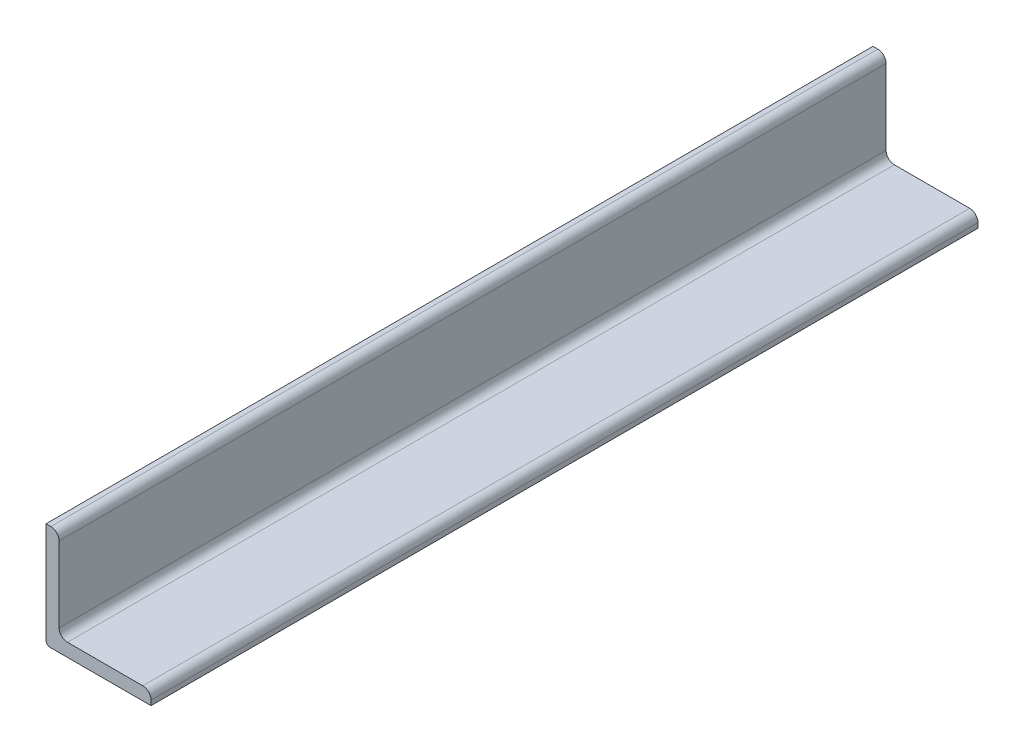
ISO-10303-21;
HEADER;
FILE_DESCRIPTION(('STEP AP214'),'2;1');
FILE_NAME('part.step','',(''),(''),'','','');
FILE_SCHEMA(('AUTOMOTIVE_DESIGN { 1 0 10303 214 1 1 1 1 }'));
ENDSEC;
DATA;
#1=APPLICATION_CONTEXT('core data for automotive mechanical design processes');
#2=APPLICATION_PROTOCOL_DEFINITION('international standard','automotive_design',2000,#1);
#3=PRODUCT_CONTEXT('',#1,'mechanical');
#4=PRODUCT('Part','Part','',(#3));
#5=PRODUCT_RELATED_PRODUCT_CATEGORY('part','',(#4));
#6=PRODUCT_DEFINITION_FORMATION('','',#4);
#7=PRODUCT_DEFINITION_CONTEXT('part definition',#1,'design');
#8=PRODUCT_DEFINITION('design','',#6,#7);
#9=PRODUCT_DEFINITION_SHAPE('','',#8);
#10=(LENGTH_UNIT() NAMED_UNIT(*) SI_UNIT(.MILLI.,.METRE.));
#11=(NAMED_UNIT(*) PLANE_ANGLE_UNIT() SI_UNIT($,.RADIAN.));
#12=(NAMED_UNIT(*) SI_UNIT($,.STERADIAN.) SOLID_ANGLE_UNIT());
#13=UNCERTAINTY_MEASURE_WITH_UNIT(LENGTH_MEASURE(1.E-05),#10,'distance_accuracy_value','');
#14=(GEOMETRIC_REPRESENTATION_CONTEXT(3) GLOBAL_UNCERTAINTY_ASSIGNED_CONTEXT((#13)) GLOBAL_UNIT_ASSIGNED_CONTEXT((#10,
#11,#12)) REPRESENTATION_CONTEXT('',''));
#15=CARTESIAN_POINT('',(0.,0.,0.));
#16=DIRECTION('',(0.,0.,1.));
#17=DIRECTION('',(1.,0.,0.));
#18=AXIS2_PLACEMENT_3D('',#15,#16,#17);
#19=CARTESIAN_POINT('',(12.7,0.,100.));
#20=DIRECTION('',(0.,1.,0.));
#21=DIRECTION('',(-1.,0.,0.));
#22=AXIS2_PLACEMENT_3D('',#19,#20,#21);
#23=PLANE('',#22);
#24=DIRECTION('',(1.,0.,0.));
#25=VECTOR('',#24,1.);
#26=CARTESIAN_POINT('',(12.7,0.,100.));
#27=LINE('',#26,#25);
#28=CARTESIAN_POINT('',(0.5,0.,100.));
#29=VERTEX_POINT('',#28);
#30=CARTESIAN_POINT('',(12.7,0.,100.));
#31=VERTEX_POINT('',#30);
#32=EDGE_CURVE('E109',#29,#31,#27,.T.);
#33=ORIENTED_EDGE('',*,*,#32,.F.);
#34=DIRECTION('',(0.,0.,-1.));
#35=VECTOR('',#34,1.);
#36=CARTESIAN_POINT('',(0.5,0.,100.));
#37=LINE('',#36,#35);
#38=CARTESIAN_POINT('',(0.5,0.,0.));
#39=VERTEX_POINT('',#38);
#40=EDGE_CURVE('E135',#29,#39,#37,.T.);
#41=ORIENTED_EDGE('',*,*,#40,.T.);
#42=DIRECTION('',(1.,0.,0.));
#43=VECTOR('',#42,1.);
#44=CARTESIAN_POINT('',(12.7,0.,0.));
#45=LINE('',#44,#43);
#46=CARTESIAN_POINT('',(12.7,0.,0.));
#47=VERTEX_POINT('',#46);
#48=EDGE_CURVE('E133',#39,#47,#45,.T.);
#49=ORIENTED_EDGE('',*,*,#48,.T.);
#50=DIRECTION('',(0.,0.,-1.));
#51=VECTOR('',#50,1.);
#52=CARTESIAN_POINT('',(12.7,0.,100.));
#53=LINE('',#52,#51);
#54=EDGE_CURVE('E127',#31,#47,#53,.T.);
#55=ORIENTED_EDGE('',*,*,#54,.F.);
#56=EDGE_LOOP('',(#33,#41,#49,#55));
#57=FACE_BOUND('',#56,.T.);
#58=ADVANCED_FACE('F32',(#57),#23,.F.);
#59=CARTESIAN_POINT('',(12.7,1.5875,100.));
#60=DIRECTION('',(-1.,0.,0.));
#61=DIRECTION('',(0.,0.,1.));
#62=AXIS2_PLACEMENT_3D('',#59,#60,#61);
#63=PLANE('',#62);
#64=DIRECTION('',(0.,1.,0.));
#65=VECTOR('',#64,1.);
#66=CARTESIAN_POINT('',(12.7,1.5875,0.));
#67=LINE('',#66,#65);
#68=CARTESIAN_POINT('',(12.7,0.587499999999999,0.));
#69=VERTEX_POINT('',#68);
#70=EDGE_CURVE('E183',#47,#69,#67,.T.);
#71=ORIENTED_EDGE('',*,*,#70,.T.);
#72=DIRECTION('',(0.,0.,-1.));
#73=VECTOR('',#72,1.);
#74=CARTESIAN_POINT('',(12.7,0.587499999999999,100.));
#75=LINE('',#74,#73);
#76=CARTESIAN_POINT('',(12.7,0.587499999999999,100.));
#77=VERTEX_POINT('',#76);
#78=EDGE_CURVE('E129',#69,#77,#75,.F.);
#79=ORIENTED_EDGE('',*,*,#78,.T.);
#80=DIRECTION('',(0.,1.,0.));
#81=VECTOR('',#80,1.);
#82=CARTESIAN_POINT('',(12.7,1.5875,100.));
#83=LINE('',#82,#81);
#84=EDGE_CURVE('E112',#31,#77,#83,.T.);
#85=ORIENTED_EDGE('',*,*,#84,.F.);
#86=ORIENTED_EDGE('',*,*,#54,.T.);
#87=EDGE_LOOP('',(#71,#79,#85,#86));
#88=FACE_BOUND('',#87,.T.);
#89=ADVANCED_FACE('F126',(#88),#63,.F.);
#90=CARTESIAN_POINT('',(1.5875,1.5875,100.));
#91=DIRECTION('',(0.,-1.,0.));
#92=DIRECTION('',(1.,0.,0.));
#93=AXIS2_PLACEMENT_3D('',#90,#91,#92);
#94=PLANE('',#93);
#95=DIRECTION('',(-1.,0.,0.));
#96=VECTOR('',#95,1.);
#97=CARTESIAN_POINT('',(1.5875,1.5875,100.));
#98=LINE('',#97,#96);
#99=CARTESIAN_POINT('',(11.7,1.5875,100.));
#100=VERTEX_POINT('',#99);
#101=CARTESIAN_POINT('',(2.5875,1.5875,100.));
#102=VERTEX_POINT('',#101);
#103=EDGE_CURVE('E130',#100,#102,#98,.T.);
#104=ORIENTED_EDGE('',*,*,#103,.F.);
#105=DIRECTION('',(0.,0.,-1.));
#106=VECTOR('',#105,1.);
#107=CARTESIAN_POINT('',(11.7,1.5875,100.));
#108=LINE('',#107,#106);
#109=CARTESIAN_POINT('',(11.7,1.5875,0.));
#110=VERTEX_POINT('',#109);
#111=EDGE_CURVE('E151',#100,#110,#108,.T.);
#112=ORIENTED_EDGE('',*,*,#111,.T.);
#113=DIRECTION('',(-1.,0.,0.));
#114=VECTOR('',#113,1.);
#115=CARTESIAN_POINT('',(1.5875,1.5875,0.));
#116=LINE('',#115,#114);
#117=CARTESIAN_POINT('',(2.5875,1.5875,0.));
#118=VERTEX_POINT('',#117);
#119=EDGE_CURVE('E173',#110,#118,#116,.T.);
#120=ORIENTED_EDGE('',*,*,#119,.T.);
#121=DIRECTION('',(0.,0.,-1.));
#122=VECTOR('',#121,1.);
#123=CARTESIAN_POINT('',(2.5875,1.5875,100.));
#124=LINE('',#123,#122);
#125=EDGE_CURVE('E149',#118,#102,#124,.F.);
#126=ORIENTED_EDGE('',*,*,#125,.T.);
#127=EDGE_LOOP('',(#104,#112,#120,#126));
#128=FACE_BOUND('',#127,.T.);
#129=ADVANCED_FACE('F180',(#128),#94,.F.);
#130=CARTESIAN_POINT('',(1.5875,12.7,100.));
#131=DIRECTION('',(-1.,0.,0.));
#132=DIRECTION('',(0.,-1.,0.));
#133=AXIS2_PLACEMENT_3D('',#130,#131,#132);
#134=PLANE('',#133);
#135=DIRECTION('',(0.,1.,0.));
#136=VECTOR('',#135,1.);
#137=CARTESIAN_POINT('',(1.5875,12.7,0.));
#138=LINE('',#137,#136);
#139=CARTESIAN_POINT('',(1.5875,2.5875,0.));
#140=VERTEX_POINT('',#139);
#141=CARTESIAN_POINT('',(1.5875,11.7,0.));
#142=VERTEX_POINT('',#141);
#143=EDGE_CURVE('E174',#140,#142,#138,.T.);
#144=ORIENTED_EDGE('',*,*,#143,.T.);
#145=DIRECTION('',(0.,0.,-1.));
#146=VECTOR('',#145,1.);
#147=CARTESIAN_POINT('',(1.5875,11.7,100.));
#148=LINE('',#147,#146);
#149=CARTESIAN_POINT('',(1.5875,11.7,100.));
#150=VERTEX_POINT('',#149);
#151=EDGE_CURVE('E55',#142,#150,#148,.F.);
#152=ORIENTED_EDGE('',*,*,#151,.T.);
#153=DIRECTION('',(0.,1.,0.));
#154=VECTOR('',#153,1.);
#155=CARTESIAN_POINT('',(1.5875,12.7,100.));
#156=LINE('',#155,#154);
#157=CARTESIAN_POINT('',(1.5875,2.5875,100.));
#158=VERTEX_POINT('',#157);
#159=EDGE_CURVE('E186',#158,#150,#156,.T.);
#160=ORIENTED_EDGE('',*,*,#159,.F.);
#161=DIRECTION('',(0.,0.,-1.));
#162=VECTOR('',#161,1.);
#163=CARTESIAN_POINT('',(1.5875,2.5875,0.));
#164=LINE('',#163,#162);
#165=EDGE_CURVE('E165',#158,#140,#164,.T.);
#166=ORIENTED_EDGE('',*,*,#165,.T.);
#167=EDGE_LOOP('',(#144,#152,#160,#166));
#168=FACE_BOUND('',#167,.T.);
#169=ADVANCED_FACE('F187',(#168),#134,.F.);
#170=CARTESIAN_POINT('',(0.,12.7,100.));
#171=DIRECTION('',(0.,-1.,0.));
#172=DIRECTION('',(0.,0.,-1.));
#173=AXIS2_PLACEMENT_3D('',#170,#171,#172);
#174=PLANE('',#173);
#175=DIRECTION('',(-1.,0.,0.));
#176=VECTOR('',#175,1.);
#177=CARTESIAN_POINT('',(0.,12.7,100.));
#178=LINE('',#177,#176);
#179=CARTESIAN_POINT('',(0.5875,12.7,100.));
#180=VERTEX_POINT('',#179);
#181=CARTESIAN_POINT('',(0.,12.7,100.));
#182=VERTEX_POINT('',#181);
#183=EDGE_CURVE('E188',#180,#182,#178,.T.);
#184=ORIENTED_EDGE('',*,*,#183,.F.);
#185=DIRECTION('',(0.,0.,-1.));
#186=VECTOR('',#185,1.);
#187=CARTESIAN_POINT('',(0.5875,12.7,100.));
#188=LINE('',#187,#186);
#189=CARTESIAN_POINT('',(0.5875,12.7,0.));
#190=VERTEX_POINT('',#189);
#191=EDGE_CURVE('E162',#180,#190,#188,.T.);
#192=ORIENTED_EDGE('',*,*,#191,.T.);
#193=DIRECTION('',(-1.,0.,0.));
#194=VECTOR('',#193,1.);
#195=CARTESIAN_POINT('',(0.,12.7,0.));
#196=LINE('',#195,#194);
#197=CARTESIAN_POINT('',(0.,12.7,0.));
#198=VERTEX_POINT('',#197);
#199=EDGE_CURVE('E197',#190,#198,#196,.T.);
#200=ORIENTED_EDGE('',*,*,#199,.T.);
#201=DIRECTION('',(0.,0.,-1.));
#202=VECTOR('',#201,1.);
#203=CARTESIAN_POINT('',(0.,12.7,100.));
#204=LINE('',#203,#202);
#205=EDGE_CURVE('E136',#182,#198,#204,.T.);
#206=ORIENTED_EDGE('',*,*,#205,.F.);
#207=EDGE_LOOP('',(#184,#192,#200,#206));
#208=FACE_BOUND('',#207,.T.);
#209=ADVANCED_FACE('F230',(#208),#174,.F.);
#210=CARTESIAN_POINT('',(0.,0.,100.));
#211=DIRECTION('',(1.,0.,0.));
#212=DIRECTION('',(0.,0.,-1.));
#213=AXIS2_PLACEMENT_3D('',#210,#211,#212);
#214=PLANE('',#213);
#215=DIRECTION('',(0.,-1.,0.));
#216=VECTOR('',#215,1.);
#217=CARTESIAN_POINT('',(0.,0.,0.));
#218=LINE('',#217,#216);
#219=CARTESIAN_POINT('',(0.,0.5,0.));
#220=VERTEX_POINT('',#219);
#221=EDGE_CURVE('E121',#198,#220,#218,.T.);
#222=ORIENTED_EDGE('',*,*,#221,.T.);
#223=DIRECTION('',(0.,0.,-1.));
#224=VECTOR('',#223,1.);
#225=CARTESIAN_POINT('',(0.,0.5,100.));
#226=LINE('',#225,#224);
#227=CARTESIAN_POINT('',(0.,0.5,100.));
#228=VERTEX_POINT('',#227);
#229=EDGE_CURVE('E146',#220,#228,#226,.F.);
#230=ORIENTED_EDGE('',*,*,#229,.T.);
#231=DIRECTION('',(0.,-1.,0.));
#232=VECTOR('',#231,1.);
#233=CARTESIAN_POINT('',(0.,0.,100.));
#234=LINE('',#233,#232);
#235=EDGE_CURVE('E141',#182,#228,#234,.T.);
#236=ORIENTED_EDGE('',*,*,#235,.F.);
#237=ORIENTED_EDGE('',*,*,#205,.T.);
#238=EDGE_LOOP('',(#222,#230,#236,#237));
#239=FACE_BOUND('',#238,.T.);
#240=ADVANCED_FACE('F202',(#239),#214,.F.);
#241=CARTESIAN_POINT('',(0.,0.,100.));
#242=DIRECTION('',(0.,0.,-1.));
#243=DIRECTION('',(-1.,0.,0.));
#244=AXIS2_PLACEMENT_3D('',#241,#242,#243);
#245=PLANE('',#244);
#246=ORIENTED_EDGE('',*,*,#84,.T.);
#247=CARTESIAN_POINT('',(11.7,0.587499999999999,100.));
#248=DIRECTION('',(0.,0.,-1.));
#249=DIRECTION('',(-1.,0.,0.));
#250=AXIS2_PLACEMENT_3D('',#247,#248,#249);
#251=CIRCLE('',#250,1.);
#252=EDGE_CURVE('E160',#77,#100,#251,.F.);
#253=ORIENTED_EDGE('',*,*,#252,.T.);
#254=ORIENTED_EDGE('',*,*,#103,.T.);
#255=CARTESIAN_POINT('',(2.5875,2.5875,100.));
#256=DIRECTION('',(0.,0.,-1.));
#257=DIRECTION('',(-1.,0.,0.));
#258=AXIS2_PLACEMENT_3D('',#255,#256,#257);
#259=CIRCLE('',#258,1.);
#260=EDGE_CURVE('E11',#102,#158,#259,.T.);
#261=ORIENTED_EDGE('',*,*,#260,.T.);
#262=ORIENTED_EDGE('',*,*,#159,.T.);
#263=CARTESIAN_POINT('',(0.5875,11.7,100.));
#264=DIRECTION('',(0.,0.,-1.));
#265=DIRECTION('',(-1.,0.,0.));
#266=AXIS2_PLACEMENT_3D('',#263,#264,#265);
#267=CIRCLE('',#266,1.);
#268=EDGE_CURVE('E47',#150,#180,#267,.F.);
#269=ORIENTED_EDGE('',*,*,#268,.T.);
#270=ORIENTED_EDGE('',*,*,#183,.T.);
#271=ORIENTED_EDGE('',*,*,#235,.T.);
#272=CARTESIAN_POINT('',(0.5,0.5,100.));
#273=DIRECTION('',(0.,0.,-1.));
#274=DIRECTION('',(-1.,0.,0.));
#275=AXIS2_PLACEMENT_3D('',#272,#273,#274);
#276=CIRCLE('',#275,0.5);
#277=EDGE_CURVE('E116',#228,#29,#276,.F.);
#278=ORIENTED_EDGE('',*,*,#277,.T.);
#279=ORIENTED_EDGE('',*,*,#32,.T.);
#280=EDGE_LOOP('',(#246,#253,#254,#261,#262,#269,#270,#271,#278,#279));
#281=FACE_BOUND('',#280,.T.);
#282=ADVANCED_FACE('F111',(#281),#245,.F.);
#283=CARTESIAN_POINT('',(0.,0.,0.));
#284=DIRECTION('',(0.,0.,-1.));
#285=DIRECTION('',(-1.,0.,0.));
#286=AXIS2_PLACEMENT_3D('',#283,#284,#285);
#287=PLANE('',#286);
#288=ORIENTED_EDGE('',*,*,#119,.F.);
#289=CARTESIAN_POINT('',(11.7,0.587499999999999,0.));
#290=DIRECTION('',(0.,0.,-1.));
#291=DIRECTION('',(-1.,0.,0.));
#292=AXIS2_PLACEMENT_3D('',#289,#290,#291);
#293=CIRCLE('',#292,1.);
#294=EDGE_CURVE('E156',#110,#69,#293,.T.);
#295=ORIENTED_EDGE('',*,*,#294,.T.);
#296=ORIENTED_EDGE('',*,*,#70,.F.);
#297=ORIENTED_EDGE('',*,*,#48,.F.);
#298=CARTESIAN_POINT('',(0.5,0.5,0.));
#299=DIRECTION('',(0.,0.,-1.));
#300=DIRECTION('',(-1.,0.,0.));
#301=AXIS2_PLACEMENT_3D('',#298,#299,#300);
#302=CIRCLE('',#301,0.5);
#303=EDGE_CURVE('E138',#39,#220,#302,.T.);
#304=ORIENTED_EDGE('',*,*,#303,.T.);
#305=ORIENTED_EDGE('',*,*,#221,.F.);
#306=ORIENTED_EDGE('',*,*,#199,.F.);
#307=CARTESIAN_POINT('',(0.5875,11.7,0.));
#308=DIRECTION('',(0.,0.,-1.));
#309=DIRECTION('',(-1.,0.,0.));
#310=AXIS2_PLACEMENT_3D('',#307,#308,#309);
#311=CIRCLE('',#310,1.);
#312=EDGE_CURVE('E154',#190,#142,#311,.T.);
#313=ORIENTED_EDGE('',*,*,#312,.T.);
#314=ORIENTED_EDGE('',*,*,#143,.F.);
#315=CARTESIAN_POINT('',(2.5875,2.5875,0.));
#316=DIRECTION('',(0.,0.,-1.));
#317=DIRECTION('',(-1.,0.,0.));
#318=AXIS2_PLACEMENT_3D('',#315,#316,#317);
#319=CIRCLE('',#318,1.);
#320=EDGE_CURVE('E40',#140,#118,#319,.F.);
#321=ORIENTED_EDGE('',*,*,#320,.T.);
#322=EDGE_LOOP('',(#288,#295,#296,#297,#304,#305,#306,#313,#314,#321));
#323=FACE_BOUND('',#322,.T.);
#324=ADVANCED_FACE('F172',(#323),#287,.T.);
#325=CARTESIAN_POINT('',(0.5,0.5,100.));
#326=DIRECTION('',(0.,0.,-1.));
#327=DIRECTION('',(-1.,0.,0.));
#328=AXIS2_PLACEMENT_3D('',#325,#326,#327);
#329=CYLINDRICAL_SURFACE('',#328,0.5);
#330=ORIENTED_EDGE('',*,*,#277,.F.);
#331=ORIENTED_EDGE('',*,*,#229,.F.);
#332=ORIENTED_EDGE('',*,*,#303,.F.);
#333=ORIENTED_EDGE('',*,*,#40,.F.);
#334=EDGE_LOOP('',(#330,#331,#332,#333));
#335=FACE_BOUND('',#334,.T.);
#336=ADVANCED_FACE('F207',(#335),#329,.T.);
#337=CARTESIAN_POINT('',(11.7,0.587499999999999,100.));
#338=DIRECTION('',(0.,0.,-1.));
#339=DIRECTION('',(-1.,0.,0.));
#340=AXIS2_PLACEMENT_3D('',#337,#338,#339);
#341=CYLINDRICAL_SURFACE('',#340,1.);
#342=ORIENTED_EDGE('',*,*,#252,.F.);
#343=ORIENTED_EDGE('',*,*,#78,.F.);
#344=ORIENTED_EDGE('',*,*,#294,.F.);
#345=ORIENTED_EDGE('',*,*,#111,.F.);
#346=EDGE_LOOP('',(#342,#343,#344,#345));
#347=FACE_BOUND('',#346,.T.);
#348=ADVANCED_FACE('F209',(#347),#341,.T.);
#349=CARTESIAN_POINT('',(0.5875,11.7,100.));
#350=DIRECTION('',(0.,0.,-1.));
#351=DIRECTION('',(-1.,0.,0.));
#352=AXIS2_PLACEMENT_3D('',#349,#350,#351);
#353=CYLINDRICAL_SURFACE('',#352,1.);
#354=ORIENTED_EDGE('',*,*,#268,.F.);
#355=ORIENTED_EDGE('',*,*,#151,.F.);
#356=ORIENTED_EDGE('',*,*,#312,.F.);
#357=ORIENTED_EDGE('',*,*,#191,.F.);
#358=EDGE_LOOP('',(#354,#355,#356,#357));
#359=FACE_BOUND('',#358,.T.);
#360=ADVANCED_FACE('F211',(#359),#353,.T.);
#361=CARTESIAN_POINT('',(2.5875,2.5875,100.));
#362=DIRECTION('',(0.,0.,1.));
#363=DIRECTION('',(1.,0.,0.));
#364=AXIS2_PLACEMENT_3D('',#361,#362,#363);
#365=CYLINDRICAL_SURFACE('',#364,1.);
#366=ORIENTED_EDGE('',*,*,#260,.F.);
#367=ORIENTED_EDGE('',*,*,#125,.F.);
#368=ORIENTED_EDGE('',*,*,#320,.F.);
#369=ORIENTED_EDGE('',*,*,#165,.F.);
#370=EDGE_LOOP('',(#366,#367,#368,#369));
#371=FACE_BOUND('',#370,.T.);
#372=ADVANCED_FACE('F34',(#371),#365,.F.);
#373=CLOSED_SHELL('',(#58,#89,#129,#169,#209,#240,#282,#324,#336,#348,#360,#372));
#374=MANIFOLD_SOLID_BREP('B2',#373);
#375=ADVANCED_BREP_SHAPE_REPRESENTATION('',(#18,#374),#14);
#376=SHAPE_DEFINITION_REPRESENTATION(#9,#375);
ENDSEC;
END-ISO-10303-21;
